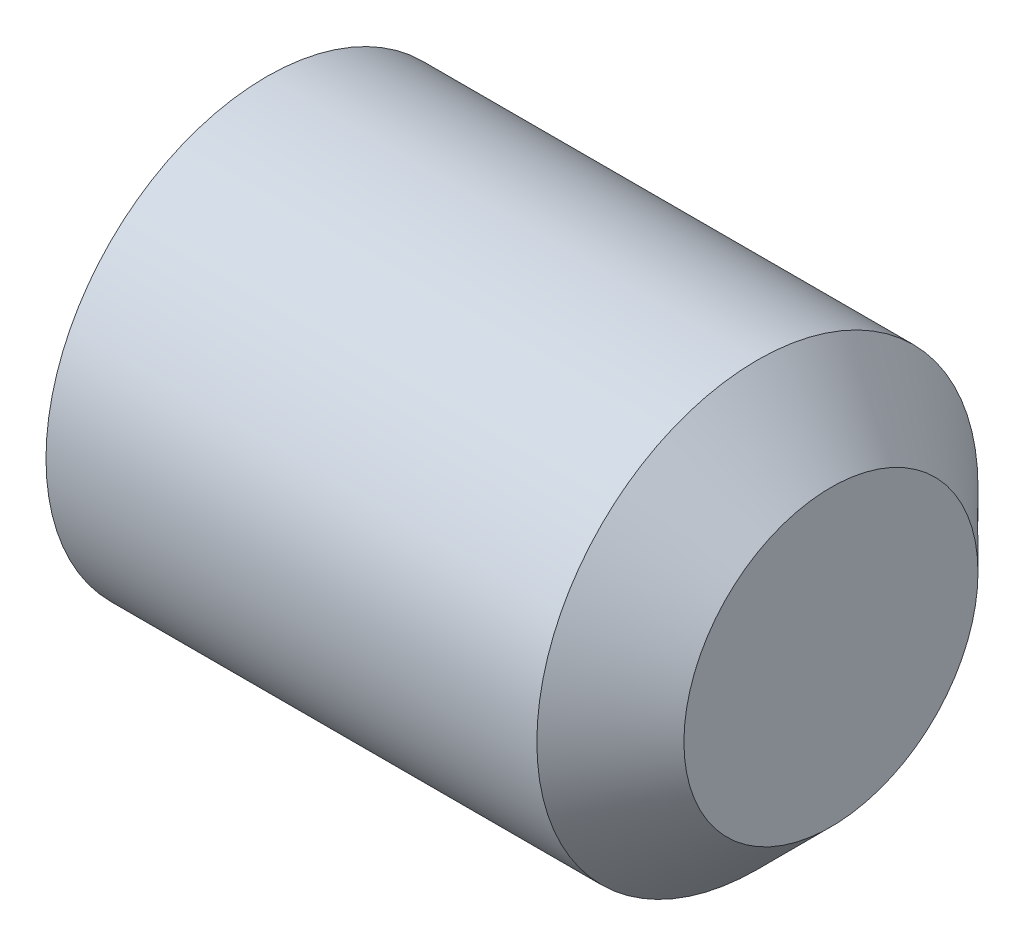
ISO-10303-21;
HEADER;
FILE_DESCRIPTION(('STEP AP214'),'2;1');
FILE_NAME('part.step','',(''),(''),'','','');
FILE_SCHEMA(('AUTOMOTIVE_DESIGN { 1 0 10303 214 1 1 1 1 }'));
ENDSEC;
DATA;
#1=APPLICATION_CONTEXT('core data for automotive mechanical design processes');
#2=APPLICATION_PROTOCOL_DEFINITION('international standard','automotive_design',2000,#1);
#3=PRODUCT_CONTEXT('',#1,'mechanical');
#4=PRODUCT('Part','Part','',(#3));
#5=PRODUCT_RELATED_PRODUCT_CATEGORY('part','',(#4));
#6=PRODUCT_DEFINITION_FORMATION('','',#4);
#7=PRODUCT_DEFINITION_CONTEXT('part definition',#1,'design');
#8=PRODUCT_DEFINITION('design','',#6,#7);
#9=PRODUCT_DEFINITION_SHAPE('','',#8);
#10=(LENGTH_UNIT() NAMED_UNIT(*) SI_UNIT(.MILLI.,.METRE.));
#11=(NAMED_UNIT(*) PLANE_ANGLE_UNIT() SI_UNIT($,.RADIAN.));
#12=(NAMED_UNIT(*) SI_UNIT($,.STERADIAN.) SOLID_ANGLE_UNIT());
#13=UNCERTAINTY_MEASURE_WITH_UNIT(LENGTH_MEASURE(1.E-05),#10,'distance_accuracy_value','');
#14=(GEOMETRIC_REPRESENTATION_CONTEXT(3) GLOBAL_UNCERTAINTY_ASSIGNED_CONTEXT((#13)) GLOBAL_UNIT_ASSIGNED_CONTEXT((#10,
#11,#12)) REPRESENTATION_CONTEXT('',''));
#15=CARTESIAN_POINT('',(0.,0.,0.));
#16=DIRECTION('',(0.,0.,1.));
#17=DIRECTION('',(1.,0.,0.));
#18=AXIS2_PLACEMENT_3D('',#15,#16,#17);
#19=CARTESIAN_POINT('',(0.,0.,0.));
#20=DIRECTION('',(-1.,0.,0.));
#21=DIRECTION('',(0.,0.,1.));
#22=AXIS2_PLACEMENT_3D('',#19,#20,#21);
#23=PLANE('',#22);
#24=CARTESIAN_POINT('',(0.,0.,0.));
#25=DIRECTION('',(-1.,0.,0.));
#26=DIRECTION('',(0.,0.,1.));
#27=AXIS2_PLACEMENT_3D('',#24,#25,#26);
#28=CIRCLE('',#27,1.2195);
#29=CARTESIAN_POINT('',(0.,0.,1.2195));
#30=VERTEX_POINT('',#29);
#31=EDGE_CURVE('E136',#30,#30,#28,.T.);
#32=ORIENTED_EDGE('',*,*,#31,.T.);
#33=EDGE_LOOP('',(#32));
#34=FACE_BOUND('',#33,.T.);
#35=DIRECTION('',(0.,0.,-1.));
#36=VECTOR('',#35,1.);
#37=CARTESIAN_POINT('',(0.,0.750000000000003,0.433012701892217));
#38=LINE('',#37,#36);
#39=CARTESIAN_POINT('',(0.,0.750000000000003,0.433012701892217));
#40=VERTEX_POINT('',#39);
#41=CARTESIAN_POINT('',(0.,0.750000000000003,-0.433012701892221));
#42=VERTEX_POINT('',#41);
#43=EDGE_CURVE('E127',#40,#42,#38,.T.);
#44=ORIENTED_EDGE('',*,*,#43,.F.);
#45=DIRECTION('',(0.,-0.866025403784439,0.5));
#46=VECTOR('',#45,1.);
#47=CARTESIAN_POINT('',(0.,0.750000000000003,0.433012701892217));
#48=LINE('',#47,#46);
#49=CARTESIAN_POINT('',(0.,0.,0.866025403784436));
#50=VERTEX_POINT('',#49);
#51=EDGE_CURVE('E49',#40,#50,#48,.T.);
#52=ORIENTED_EDGE('',*,*,#51,.T.);
#53=DIRECTION('',(0.,0.866025403784439,0.5));
#54=VECTOR('',#53,1.);
#55=CARTESIAN_POINT('',(0.,-0.749999999999997,0.433012701892217));
#56=LINE('',#55,#54);
#57=CARTESIAN_POINT('',(0.,-0.749999999999997,0.433012701892217));
#58=VERTEX_POINT('',#57);
#59=EDGE_CURVE('E118',#58,#50,#56,.T.);
#60=ORIENTED_EDGE('',*,*,#59,.F.);
#61=DIRECTION('',(0.,0.,-1.));
#62=VECTOR('',#61,1.);
#63=CARTESIAN_POINT('',(0.,-0.749999999999997,0.433012701892217));
#64=LINE('',#63,#62);
#65=CARTESIAN_POINT('',(0.,-0.749999999999997,-0.433012701892222));
#66=VERTEX_POINT('',#65);
#67=EDGE_CURVE('E121',#58,#66,#64,.T.);
#68=ORIENTED_EDGE('',*,*,#67,.T.);
#69=DIRECTION('',(0.,0.866025403784439,-0.5));
#70=VECTOR('',#69,1.);
#71=CARTESIAN_POINT('',(0.,-0.749999999999997,-0.433012701892222));
#72=LINE('',#71,#70);
#73=CARTESIAN_POINT('',(0.,0.,-0.866025403784441));
#74=VERTEX_POINT('',#73);
#75=EDGE_CURVE('E124',#66,#74,#72,.T.);
#76=ORIENTED_EDGE('',*,*,#75,.T.);
#77=DIRECTION('',(0.,-0.866025403784439,-0.5));
#78=VECTOR('',#77,1.);
#79=CARTESIAN_POINT('',(0.,0.750000000000003,-0.433012701892221));
#80=LINE('',#79,#78);
#81=EDGE_CURVE('E107',#42,#74,#80,.T.);
#82=ORIENTED_EDGE('',*,*,#81,.F.);
#83=EDGE_LOOP('',(#44,#52,#60,#68,#76,#82));
#84=FACE_BOUND('',#83,.T.);
#85=ADVANCED_FACE('F34',(#34,#84),#23,.T.);
#86=CARTESIAN_POINT('',(4.,1.,0.));
#87=DIRECTION('',(1.,0.,0.));
#88=DIRECTION('',(0.,0.,-1.));
#89=AXIS2_PLACEMENT_3D('',#86,#87,#88);
#90=PLANE('',#89);
#91=CARTESIAN_POINT('',(4.,0.,0.));
#92=DIRECTION('',(-1.,0.,0.));
#93=DIRECTION('',(0.,0.,1.));
#94=AXIS2_PLACEMENT_3D('',#91,#92,#93);
#95=CIRCLE('',#94,1.);
#96=CARTESIAN_POINT('',(4.,0.,1.));
#97=VERTEX_POINT('',#96);
#98=EDGE_CURVE('E11',#97,#97,#95,.T.);
#99=ORIENTED_EDGE('',*,*,#98,.F.);
#100=EDGE_LOOP('',(#99));
#101=FACE_BOUND('',#100,.T.);
#102=ADVANCED_FACE('F36',(#101),#90,.T.);
#103=CARTESIAN_POINT('',(3.5,0.,0.));
#104=DIRECTION('',(-1.,0.,0.));
#105=DIRECTION('',(0.,0.,1.));
#106=AXIS2_PLACEMENT_3D('',#103,#104,#105);
#107=CONICAL_SURFACE('',#106,1.5,0.785398163397444);
#108=ORIENTED_EDGE('',*,*,#98,.T.);
#109=EDGE_LOOP('',(#108));
#110=FACE_BOUND('',#109,.T.);
#111=CARTESIAN_POINT('',(3.5,0.,0.));
#112=DIRECTION('',(-1.,0.,0.));
#113=DIRECTION('',(0.,0.,1.));
#114=AXIS2_PLACEMENT_3D('',#111,#112,#113);
#115=CIRCLE('',#114,1.5);
#116=CARTESIAN_POINT('',(3.5,0.,1.5));
#117=VERTEX_POINT('',#116);
#118=EDGE_CURVE('E42',#117,#117,#115,.T.);
#119=ORIENTED_EDGE('',*,*,#118,.F.);
#120=EDGE_LOOP('',(#119));
#121=FACE_BOUND('',#120,.T.);
#122=ADVANCED_FACE('F147',(#110,#121),#107,.T.);
#123=CARTESIAN_POINT('',(-12.7,0.,0.));
#124=DIRECTION('',(-1.,0.,0.));
#125=DIRECTION('',(0.,0.,1.));
#126=AXIS2_PLACEMENT_3D('',#123,#124,#125);
#127=CYLINDRICAL_SURFACE('',#126,1.5);
#128=ORIENTED_EDGE('',*,*,#118,.T.);
#129=EDGE_LOOP('',(#128));
#130=FACE_BOUND('',#129,.T.);
#131=CARTESIAN_POINT('',(0.161946750507689,0.,0.));
#132=DIRECTION('',(-1.,0.,0.));
#133=DIRECTION('',(0.,0.,1.));
#134=AXIS2_PLACEMENT_3D('',#131,#132,#133);
#135=CIRCLE('',#134,1.5);
#136=CARTESIAN_POINT('',(0.161946750507689,0.,1.5));
#137=VERTEX_POINT('',#136);
#138=EDGE_CURVE('E139',#137,#137,#135,.T.);
#139=ORIENTED_EDGE('',*,*,#138,.F.);
#140=EDGE_LOOP('',(#139));
#141=FACE_BOUND('',#140,.T.);
#142=ADVANCED_FACE('F144',(#130,#141),#127,.T.);
#143=CARTESIAN_POINT('',(0.,0.,0.));
#144=DIRECTION('',(1.,0.,0.));
#145=DIRECTION('',(0.,0.,-1.));
#146=AXIS2_PLACEMENT_3D('',#143,#144,#145);
#147=CONICAL_SURFACE('',#146,1.2195,1.0471975511966);
#148=ORIENTED_EDGE('',*,*,#138,.T.);
#149=EDGE_LOOP('',(#148));
#150=FACE_BOUND('',#149,.T.);
#151=ORIENTED_EDGE('',*,*,#31,.F.);
#152=EDGE_LOOP('',(#151));
#153=FACE_BOUND('',#152,.T.);
#154=ADVANCED_FACE('F154',(#150,#153),#147,.T.);
#155=CARTESIAN_POINT('',(2.,0.750000000000003,0.433012701892217));
#156=DIRECTION('',(0.,-0.5,-0.866025403784439));
#157=DIRECTION('',(0.,0.866025403784439,-0.5));
#158=AXIS2_PLACEMENT_3D('',#155,#156,#157);
#159=PLANE('',#158);
#160=ORIENTED_EDGE('',*,*,#51,.F.);
#161=DIRECTION('',(-1.,0.,0.));
#162=VECTOR('',#161,1.);
#163=CARTESIAN_POINT('',(2.,0.750000000000003,0.433012701892217));
#164=LINE('',#163,#162);
#165=CARTESIAN_POINT('',(2.,0.750000000000003,0.433012701892217));
#166=VERTEX_POINT('',#165);
#167=EDGE_CURVE('E54',#166,#40,#164,.T.);
#168=ORIENTED_EDGE('',*,*,#167,.F.);
#169=DIRECTION('',(0.,-0.866025403784439,0.5));
#170=VECTOR('',#169,1.);
#171=CARTESIAN_POINT('',(2.,0.750000000000003,0.433012701892217));
#172=LINE('',#171,#170);
#173=CARTESIAN_POINT('',(2.,0.,0.866025403784436));
#174=VERTEX_POINT('',#173);
#175=EDGE_CURVE('E81',#166,#174,#172,.T.);
#176=ORIENTED_EDGE('',*,*,#175,.T.);
#177=DIRECTION('',(-1.,0.,0.));
#178=VECTOR('',#177,1.);
#179=CARTESIAN_POINT('',(2.,0.,0.866025403784436));
#180=LINE('',#179,#178);
#181=EDGE_CURVE('E134',#174,#50,#180,.T.);
#182=ORIENTED_EDGE('',*,*,#181,.T.);
#183=EDGE_LOOP('',(#160,#168,#176,#182));
#184=FACE_BOUND('',#183,.T.);
#185=ADVANCED_FACE('F165',(#184),#159,.T.);
#186=CARTESIAN_POINT('',(2.,-0.749999999999997,0.433012701892217));
#187=DIRECTION('',(0.,-0.5,0.866025403784439));
#188=DIRECTION('',(0.,-0.866025403784439,-0.5));
#189=AXIS2_PLACEMENT_3D('',#186,#187,#188);
#190=PLANE('',#189);
#191=ORIENTED_EDGE('',*,*,#59,.T.);
#192=ORIENTED_EDGE('',*,*,#181,.F.);
#193=DIRECTION('',(0.,0.866025403784439,0.5));
#194=VECTOR('',#193,1.);
#195=CARTESIAN_POINT('',(2.,-0.749999999999997,0.433012701892217));
#196=LINE('',#195,#194);
#197=CARTESIAN_POINT('',(2.,-0.749999999999997,0.433012701892217));
#198=VERTEX_POINT('',#197);
#199=EDGE_CURVE('E265',#198,#174,#196,.T.);
#200=ORIENTED_EDGE('',*,*,#199,.F.);
#201=DIRECTION('',(-1.,0.,0.));
#202=VECTOR('',#201,1.);
#203=CARTESIAN_POINT('',(2.,-0.749999999999997,0.433012701892217));
#204=LINE('',#203,#202);
#205=EDGE_CURVE('E132',#198,#58,#204,.T.);
#206=ORIENTED_EDGE('',*,*,#205,.T.);
#207=EDGE_LOOP('',(#191,#192,#200,#206));
#208=FACE_BOUND('',#207,.T.);
#209=ADVANCED_FACE('F172',(#208),#190,.F.);
#210=CARTESIAN_POINT('',(2.,-0.749999999999997,0.433012701892217));
#211=DIRECTION('',(0.,1.,0.));
#212=DIRECTION('',(0.,0.,1.));
#213=AXIS2_PLACEMENT_3D('',#210,#211,#212);
#214=PLANE('',#213);
#215=ORIENTED_EDGE('',*,*,#67,.F.);
#216=ORIENTED_EDGE('',*,*,#205,.F.);
#217=DIRECTION('',(0.,0.,-1.));
#218=VECTOR('',#217,1.);
#219=CARTESIAN_POINT('',(2.,-0.749999999999997,0.433012701892217));
#220=LINE('',#219,#218);
#221=CARTESIAN_POINT('',(2.,-0.749999999999997,-0.433012701892222));
#222=VERTEX_POINT('',#221);
#223=EDGE_CURVE('E102',#198,#222,#220,.T.);
#224=ORIENTED_EDGE('',*,*,#223,.T.);
#225=DIRECTION('',(-1.,0.,0.));
#226=VECTOR('',#225,1.);
#227=CARTESIAN_POINT('',(2.,-0.749999999999997,-0.433012701892222));
#228=LINE('',#227,#226);
#229=EDGE_CURVE('E97',#222,#66,#228,.T.);
#230=ORIENTED_EDGE('',*,*,#229,.T.);
#231=EDGE_LOOP('',(#215,#216,#224,#230));
#232=FACE_BOUND('',#231,.T.);
#233=ADVANCED_FACE('F179',(#232),#214,.T.);
#234=CARTESIAN_POINT('',(2.,-0.749999999999997,-0.433012701892222));
#235=DIRECTION('',(0.,0.5,0.866025403784439));
#236=DIRECTION('',(0.,-0.866025403784439,0.5));
#237=AXIS2_PLACEMENT_3D('',#234,#235,#236);
#238=PLANE('',#237);
#239=ORIENTED_EDGE('',*,*,#75,.F.);
#240=ORIENTED_EDGE('',*,*,#229,.F.);
#241=DIRECTION('',(0.,0.866025403784439,-0.5));
#242=VECTOR('',#241,1.);
#243=CARTESIAN_POINT('',(2.,-0.749999999999997,-0.433012701892222));
#244=LINE('',#243,#242);
#245=CARTESIAN_POINT('',(2.,0.,-0.866025403784441));
#246=VERTEX_POINT('',#245);
#247=EDGE_CURVE('E92',#222,#246,#244,.T.);
#248=ORIENTED_EDGE('',*,*,#247,.T.);
#249=DIRECTION('',(-1.,0.,0.));
#250=VECTOR('',#249,1.);
#251=CARTESIAN_POINT('',(2.,0.,-0.866025403784441));
#252=LINE('',#251,#250);
#253=EDGE_CURVE('E96',#246,#74,#252,.T.);
#254=ORIENTED_EDGE('',*,*,#253,.T.);
#255=EDGE_LOOP('',(#239,#240,#248,#254));
#256=FACE_BOUND('',#255,.T.);
#257=ADVANCED_FACE('F95',(#256),#238,.T.);
#258=CARTESIAN_POINT('',(2.,0.750000000000003,-0.433012701892221));
#259=DIRECTION('',(0.,0.5,-0.866025403784439));
#260=DIRECTION('',(0.,0.866025403784439,0.5));
#261=AXIS2_PLACEMENT_3D('',#258,#259,#260);
#262=PLANE('',#261);
#263=ORIENTED_EDGE('',*,*,#81,.T.);
#264=ORIENTED_EDGE('',*,*,#253,.F.);
#265=DIRECTION('',(0.,-0.866025403784439,-0.5));
#266=VECTOR('',#265,1.);
#267=CARTESIAN_POINT('',(2.,0.750000000000003,-0.433012701892221));
#268=LINE('',#267,#266);
#269=CARTESIAN_POINT('',(2.,0.750000000000003,-0.433012701892221));
#270=VERTEX_POINT('',#269);
#271=EDGE_CURVE('E101',#270,#246,#268,.T.);
#272=ORIENTED_EDGE('',*,*,#271,.F.);
#273=DIRECTION('',(-1.,0.,0.));
#274=VECTOR('',#273,1.);
#275=CARTESIAN_POINT('',(2.,0.750000000000003,-0.433012701892221));
#276=LINE('',#275,#274);
#277=EDGE_CURVE('E77',#270,#42,#276,.T.);
#278=ORIENTED_EDGE('',*,*,#277,.T.);
#279=EDGE_LOOP('',(#263,#264,#272,#278));
#280=FACE_BOUND('',#279,.T.);
#281=ADVANCED_FACE('F104',(#280),#262,.F.);
#282=CARTESIAN_POINT('',(2.,0.750000000000003,0.433012701892217));
#283=DIRECTION('',(0.,1.,0.));
#284=DIRECTION('',(0.,0.,1.));
#285=AXIS2_PLACEMENT_3D('',#282,#283,#284);
#286=PLANE('',#285);
#287=ORIENTED_EDGE('',*,*,#43,.T.);
#288=ORIENTED_EDGE('',*,*,#277,.F.);
#289=DIRECTION('',(0.,0.,-1.));
#290=VECTOR('',#289,1.);
#291=CARTESIAN_POINT('',(2.,0.750000000000003,0.433012701892217));
#292=LINE('',#291,#290);
#293=EDGE_CURVE('E112',#166,#270,#292,.T.);
#294=ORIENTED_EDGE('',*,*,#293,.F.);
#295=ORIENTED_EDGE('',*,*,#167,.T.);
#296=EDGE_LOOP('',(#287,#288,#294,#295));
#297=FACE_BOUND('',#296,.T.);
#298=ADVANCED_FACE('F191',(#297),#286,.F.);
#299=CARTESIAN_POINT('',(2.,0.750000000000003,0.433012701892217));
#300=DIRECTION('',(1.,0.,0.));
#301=DIRECTION('',(0.,0.,-1.));
#302=AXIS2_PLACEMENT_3D('',#299,#300,#301);
#303=PLANE('',#302);
#304=ORIENTED_EDGE('',*,*,#175,.F.);
#305=ORIENTED_EDGE('',*,*,#293,.T.);
#306=ORIENTED_EDGE('',*,*,#271,.T.);
#307=ORIENTED_EDGE('',*,*,#247,.F.);
#308=ORIENTED_EDGE('',*,*,#223,.F.);
#309=ORIENTED_EDGE('',*,*,#199,.T.);
#310=EDGE_LOOP('',(#304,#305,#306,#307,#308,#309));
#311=FACE_BOUND('',#310,.T.);
#312=ADVANCED_FACE('F110',(#311),#303,.F.);
#313=CLOSED_SHELL('',(#85,#102,#122,#142,#154,#185,#209,#233,#257,#281,#298,#312));
#314=MANIFOLD_SOLID_BREP('B2',#313);
#315=ADVANCED_BREP_SHAPE_REPRESENTATION('',(#18,#314),#14);
#316=SHAPE_DEFINITION_REPRESENTATION(#9,#315);
ENDSEC;
END-ISO-10303-21;
